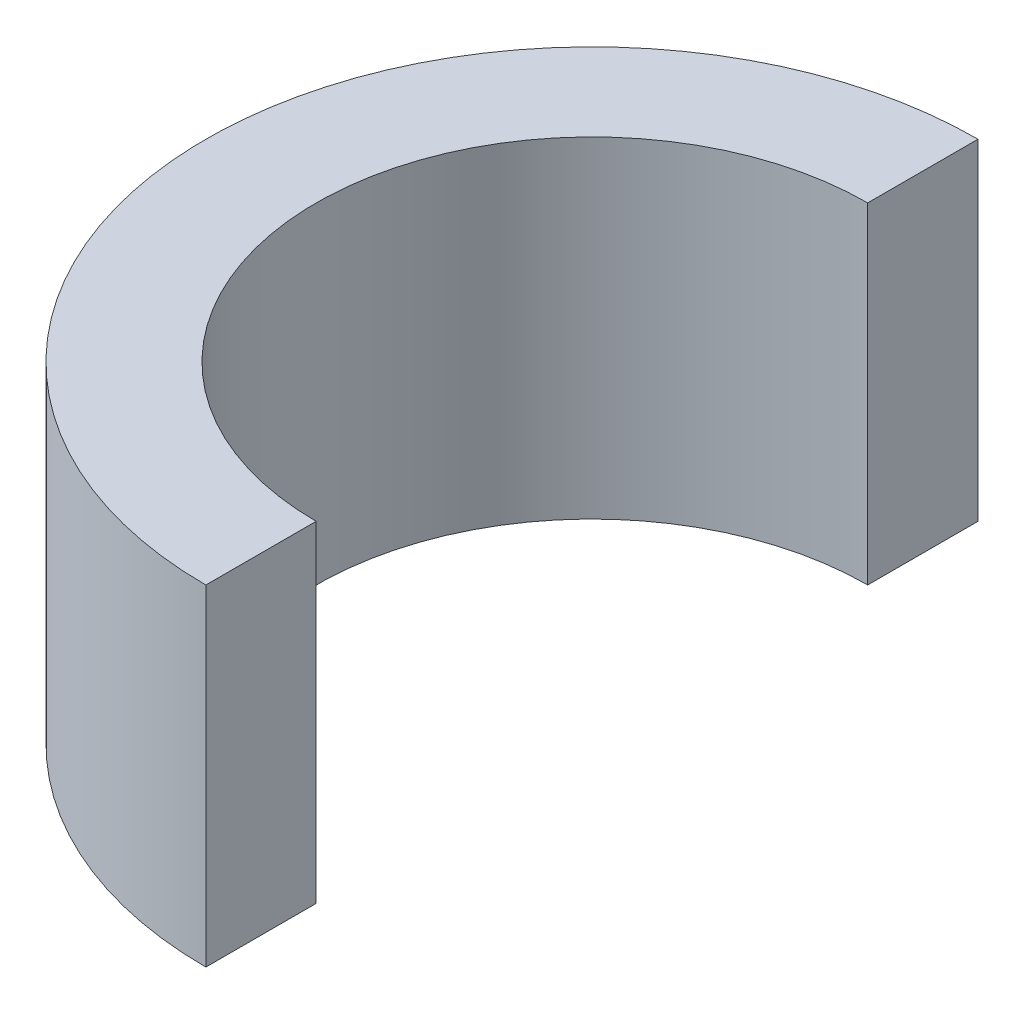
ISO-10303-21;
HEADER;
FILE_DESCRIPTION(('STEP AP214'),'2;1');
FILE_NAME('part.step','',(''),(''),'','','');
FILE_SCHEMA(('AUTOMOTIVE_DESIGN { 1 0 10303 214 1 1 1 1 }'));
ENDSEC;
DATA;
#1=APPLICATION_CONTEXT('core data for automotive mechanical design processes');
#2=APPLICATION_PROTOCOL_DEFINITION('international standard','automotive_design',2000,#1);
#3=PRODUCT_CONTEXT('',#1,'mechanical');
#4=PRODUCT('Part','Part','',(#3));
#5=PRODUCT_RELATED_PRODUCT_CATEGORY('part','',(#4));
#6=PRODUCT_DEFINITION_FORMATION('','',#4);
#7=PRODUCT_DEFINITION_CONTEXT('part definition',#1,'design');
#8=PRODUCT_DEFINITION('design','',#6,#7);
#9=PRODUCT_DEFINITION_SHAPE('','',#8);
#10=(LENGTH_UNIT() NAMED_UNIT(*) SI_UNIT(.MILLI.,.METRE.));
#11=(NAMED_UNIT(*) PLANE_ANGLE_UNIT() SI_UNIT($,.RADIAN.));
#12=(NAMED_UNIT(*) SI_UNIT($,.STERADIAN.) SOLID_ANGLE_UNIT());
#13=UNCERTAINTY_MEASURE_WITH_UNIT(LENGTH_MEASURE(1.E-05),#10,'distance_accuracy_value','');
#14=(GEOMETRIC_REPRESENTATION_CONTEXT(3) GLOBAL_UNCERTAINTY_ASSIGNED_CONTEXT((#13)) GLOBAL_UNIT_ASSIGNED_CONTEXT((#10,
#11,#12)) REPRESENTATION_CONTEXT('',''));
#15=CARTESIAN_POINT('',(0.,0.,0.));
#16=DIRECTION('',(0.,0.,1.));
#17=DIRECTION('',(1.,0.,0.));
#18=AXIS2_PLACEMENT_3D('',#15,#16,#17);
#19=CARTESIAN_POINT('',(0.,6.,0.));
#20=DIRECTION('',(-1.,0.,0.));
#21=DIRECTION('',(0.,0.,1.));
#22=AXIS2_PLACEMENT_3D('',#19,#20,#21);
#23=PLANE('',#22);
#24=DIRECTION('',(0.,0.,-1.));
#25=VECTOR('',#24,1.);
#26=CARTESIAN_POINT('',(0.,0.,0.));
#27=LINE('',#26,#25);
#28=CARTESIAN_POINT('',(0.,0.,-5.));
#29=VERTEX_POINT('',#28);
#30=CARTESIAN_POINT('',(0.,0.,-7.));
#31=VERTEX_POINT('',#30);
#32=EDGE_CURVE('E106',#29,#31,#27,.T.);
#33=ORIENTED_EDGE('',*,*,#32,.T.);
#34=DIRECTION('',(0.,-1.,0.));
#35=VECTOR('',#34,1.);
#36=CARTESIAN_POINT('',(0.,6.,-7.));
#37=LINE('',#36,#35);
#38=CARTESIAN_POINT('',(0.,6.,-7.));
#39=VERTEX_POINT('',#38);
#40=EDGE_CURVE('E11',#39,#31,#37,.T.);
#41=ORIENTED_EDGE('',*,*,#40,.F.);
#42=DIRECTION('',(0.,0.,-1.));
#43=VECTOR('',#42,1.);
#44=CARTESIAN_POINT('',(0.,6.,0.));
#45=LINE('',#44,#43);
#46=CARTESIAN_POINT('',(0.,6.,-5.));
#47=VERTEX_POINT('',#46);
#48=EDGE_CURVE('E92',#47,#39,#45,.T.);
#49=ORIENTED_EDGE('',*,*,#48,.F.);
#50=DIRECTION('',(0.,-1.,0.));
#51=VECTOR('',#50,1.);
#52=CARTESIAN_POINT('',(0.,6.,-5.));
#53=LINE('',#52,#51);
#54=EDGE_CURVE('E59',#47,#29,#53,.T.);
#55=ORIENTED_EDGE('',*,*,#54,.T.);
#56=EDGE_LOOP('',(#33,#41,#49,#55));
#57=FACE_BOUND('',#56,.T.);
#58=ADVANCED_FACE('F43',(#57),#23,.F.);
#59=CARTESIAN_POINT('',(0.,6.,0.));
#60=DIRECTION('',(0.,-1.,0.));
#61=DIRECTION('',(0.,0.,-1.));
#62=AXIS2_PLACEMENT_3D('',#59,#60,#61);
#63=CYLINDRICAL_SURFACE('',#62,7.);
#64=CARTESIAN_POINT('',(0.,0.,0.));
#65=DIRECTION('',(0.,1.,0.));
#66=DIRECTION('',(0.,0.,1.));
#67=AXIS2_PLACEMENT_3D('',#64,#65,#66);
#68=CIRCLE('',#67,7.);
#69=CARTESIAN_POINT('',(0.,0.,7.));
#70=VERTEX_POINT('',#69);
#71=EDGE_CURVE('E97',#31,#70,#68,.T.);
#72=ORIENTED_EDGE('',*,*,#71,.T.);
#73=DIRECTION('',(0.,-1.,0.));
#74=VECTOR('',#73,1.);
#75=CARTESIAN_POINT('',(0.,6.,7.));
#76=LINE('',#75,#74);
#77=CARTESIAN_POINT('',(0.,6.,7.));
#78=VERTEX_POINT('',#77);
#79=EDGE_CURVE('E51',#78,#70,#76,.T.);
#80=ORIENTED_EDGE('',*,*,#79,.F.);
#81=CARTESIAN_POINT('',(0.,6.,0.));
#82=DIRECTION('',(0.,1.,0.));
#83=DIRECTION('',(0.,0.,1.));
#84=AXIS2_PLACEMENT_3D('',#81,#82,#83);
#85=CIRCLE('',#84,7.);
#86=EDGE_CURVE('E84',#39,#78,#85,.T.);
#87=ORIENTED_EDGE('',*,*,#86,.F.);
#88=ORIENTED_EDGE('',*,*,#40,.T.);
#89=EDGE_LOOP('',(#72,#80,#87,#88));
#90=FACE_BOUND('',#89,.T.);
#91=ADVANCED_FACE('F96',(#90),#63,.T.);
#92=CARTESIAN_POINT('',(0.,6.,0.));
#93=DIRECTION('',(1.,0.,0.));
#94=DIRECTION('',(0.,0.,-1.));
#95=AXIS2_PLACEMENT_3D('',#92,#93,#94);
#96=PLANE('',#95);
#97=DIRECTION('',(0.,0.,1.));
#98=VECTOR('',#97,1.);
#99=CARTESIAN_POINT('',(0.,0.,0.));
#100=LINE('',#99,#98);
#101=CARTESIAN_POINT('',(0.,0.,5.));
#102=VERTEX_POINT('',#101);
#103=EDGE_CURVE('E109',#102,#70,#100,.T.);
#104=ORIENTED_EDGE('',*,*,#103,.F.);
#105=DIRECTION('',(0.,-1.,0.));
#106=VECTOR('',#105,1.);
#107=CARTESIAN_POINT('',(0.,6.,5.));
#108=LINE('',#107,#106);
#109=CARTESIAN_POINT('',(0.,6.,5.));
#110=VERTEX_POINT('',#109);
#111=EDGE_CURVE('E73',#110,#102,#108,.T.);
#112=ORIENTED_EDGE('',*,*,#111,.F.);
#113=DIRECTION('',(0.,0.,1.));
#114=VECTOR('',#113,1.);
#115=CARTESIAN_POINT('',(0.,6.,0.));
#116=LINE('',#115,#114);
#117=EDGE_CURVE('E91',#110,#78,#116,.T.);
#118=ORIENTED_EDGE('',*,*,#117,.T.);
#119=ORIENTED_EDGE('',*,*,#79,.T.);
#120=EDGE_LOOP('',(#104,#112,#118,#119));
#121=FACE_BOUND('',#120,.T.);
#122=ADVANCED_FACE('F100',(#121),#96,.T.);
#123=CARTESIAN_POINT('',(0.,6.,0.));
#124=DIRECTION('',(0.,-1.,0.));
#125=DIRECTION('',(0.,0.,-1.));
#126=AXIS2_PLACEMENT_3D('',#123,#124,#125);
#127=CYLINDRICAL_SURFACE('',#126,5.);
#128=CARTESIAN_POINT('',(0.,0.,0.));
#129=DIRECTION('',(0.,1.,0.));
#130=DIRECTION('',(0.,0.,1.));
#131=AXIS2_PLACEMENT_3D('',#128,#129,#130);
#132=CIRCLE('',#131,5.);
#133=EDGE_CURVE('E111',#29,#102,#132,.T.);
#134=ORIENTED_EDGE('',*,*,#133,.F.);
#135=ORIENTED_EDGE('',*,*,#54,.F.);
#136=CARTESIAN_POINT('',(0.,6.,0.));
#137=DIRECTION('',(0.,1.,0.));
#138=DIRECTION('',(0.,0.,1.));
#139=AXIS2_PLACEMENT_3D('',#136,#137,#138);
#140=CIRCLE('',#139,5.);
#141=EDGE_CURVE('E101',#47,#110,#140,.T.);
#142=ORIENTED_EDGE('',*,*,#141,.T.);
#143=ORIENTED_EDGE('',*,*,#111,.T.);
#144=EDGE_LOOP('',(#134,#135,#142,#143));
#145=FACE_BOUND('',#144,.T.);
#146=ADVANCED_FACE('F117',(#145),#127,.F.);
#147=CARTESIAN_POINT('',(0.,6.,0.));
#148=DIRECTION('',(0.,1.,0.));
#149=DIRECTION('',(0.,0.,1.));
#150=AXIS2_PLACEMENT_3D('',#147,#148,#149);
#151=PLANE('',#150);
#152=ORIENTED_EDGE('',*,*,#48,.T.);
#153=ORIENTED_EDGE('',*,*,#86,.T.);
#154=ORIENTED_EDGE('',*,*,#117,.F.);
#155=ORIENTED_EDGE('',*,*,#141,.F.);
#156=EDGE_LOOP('',(#152,#153,#154,#155));
#157=FACE_BOUND('',#156,.T.);
#158=ADVANCED_FACE('F88',(#157),#151,.T.);
#159=CARTESIAN_POINT('',(0.,0.,0.));
#160=DIRECTION('',(0.,1.,0.));
#161=DIRECTION('',(0.,0.,1.));
#162=AXIS2_PLACEMENT_3D('',#159,#160,#161);
#163=PLANE('',#162);
#164=ORIENTED_EDGE('',*,*,#32,.F.);
#165=ORIENTED_EDGE('',*,*,#133,.T.);
#166=ORIENTED_EDGE('',*,*,#103,.T.);
#167=ORIENTED_EDGE('',*,*,#71,.F.);
#168=EDGE_LOOP('',(#164,#165,#166,#167));
#169=FACE_BOUND('',#168,.T.);
#170=ADVANCED_FACE('F116',(#169),#163,.F.);
#171=CLOSED_SHELL('',(#58,#91,#122,#146,#158,#170));
#172=MANIFOLD_SOLID_BREP('B2',#171);
#173=ADVANCED_BREP_SHAPE_REPRESENTATION('',(#18,#172),#14);
#174=SHAPE_DEFINITION_REPRESENTATION(#9,#173);
ENDSEC;
END-ISO-10303-21;
